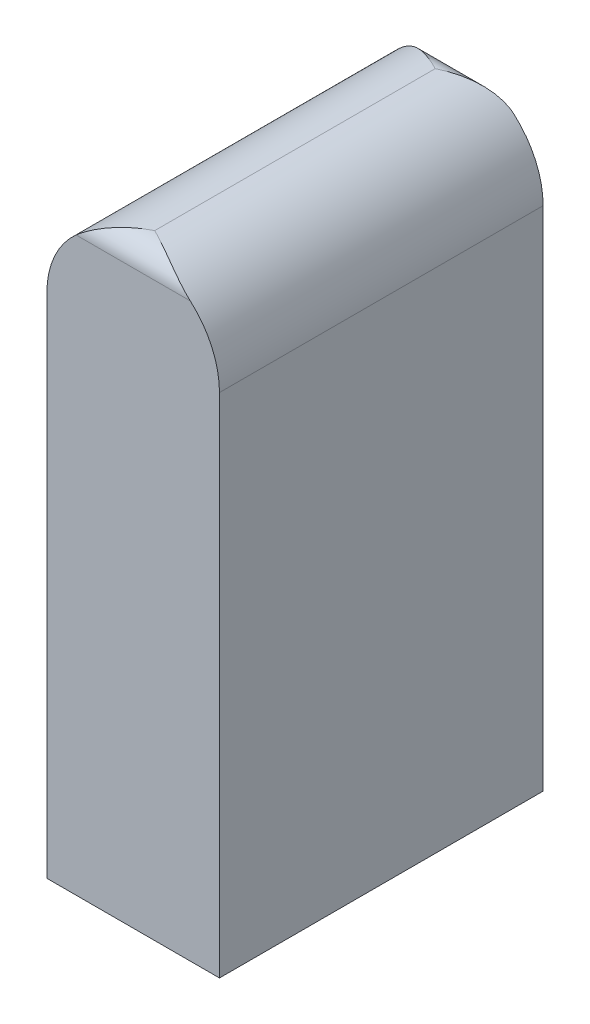
ISO-10303-21;
HEADER;
FILE_DESCRIPTION(('STEP AP214'),'2;1');
FILE_NAME('part.step','',(''),(''),'','','');
FILE_SCHEMA(('AUTOMOTIVE_DESIGN { 1 0 10303 214 1 1 1 1 }'));
ENDSEC;
DATA;
#1=APPLICATION_CONTEXT('core data for automotive mechanical design processes');
#2=APPLICATION_PROTOCOL_DEFINITION('international standard','automotive_design',2000,#1);
#3=PRODUCT_CONTEXT('',#1,'mechanical');
#4=PRODUCT('Part','Part','',(#3));
#5=PRODUCT_RELATED_PRODUCT_CATEGORY('part','',(#4));
#6=PRODUCT_DEFINITION_FORMATION('','',#4);
#7=PRODUCT_DEFINITION_CONTEXT('part definition',#1,'design');
#8=PRODUCT_DEFINITION('design','',#6,#7);
#9=PRODUCT_DEFINITION_SHAPE('','',#8);
#10=(LENGTH_UNIT() NAMED_UNIT(*) SI_UNIT(.MILLI.,.METRE.));
#11=(NAMED_UNIT(*) PLANE_ANGLE_UNIT() SI_UNIT($,.RADIAN.));
#12=(NAMED_UNIT(*) SI_UNIT($,.STERADIAN.) SOLID_ANGLE_UNIT());
#13=UNCERTAINTY_MEASURE_WITH_UNIT(LENGTH_MEASURE(1.E-05),#10,'distance_accuracy_value','');
#14=(GEOMETRIC_REPRESENTATION_CONTEXT(3) GLOBAL_UNCERTAINTY_ASSIGNED_CONTEXT((#13)) GLOBAL_UNIT_ASSIGNED_CONTEXT((#10,
#11,#12)) REPRESENTATION_CONTEXT('',''));
#15=CARTESIAN_POINT('',(0.,0.,0.));
#16=DIRECTION('',(0.,0.,1.));
#17=DIRECTION('',(1.,0.,0.));
#18=AXIS2_PLACEMENT_3D('',#15,#16,#17);
#19=CARTESIAN_POINT('',(8.,19.5,-13.));
#20=DIRECTION('',(0.,0.,1.));
#21=DIRECTION('',(1.,0.,0.));
#22=AXIS2_PLACEMENT_3D('',#19,#20,#21);
#23=CYLINDRICAL_SURFACE('',#22,8.);
#24=DIRECTION('',(0.,0.,1.));
#25=VECTOR('',#24,1.);
#26=CARTESIAN_POINT('',(8.,27.5,13.));
#27=LINE('',#26,#25);
#28=CARTESIAN_POINT('',(8.,27.5,13.));
#29=VERTEX_POINT('',#28);
#30=CARTESIAN_POINT('',(8.,27.5,-13.));
#31=VERTEX_POINT('',#30);
#32=EDGE_CURVE('E158',#29,#31,#27,.F.);
#33=ORIENTED_EDGE('',*,*,#32,.T.);
#34=CARTESIAN_POINT('',(2.7084973778708,25.5,-15.));
#35=CARTESIAN_POINT('',(2.80616741198035,25.5861628768891,-14.9999554815927));
#36=CARTESIAN_POINT('',(2.90586813397702,25.6698251299835,-14.9944373304518));
#37=CARTESIAN_POINT('',(3.10844472489316,25.8316168952697,-14.9740076754397));
#38=CARTESIAN_POINT('',(3.21131413751256,25.9097567108975,-14.9591142072519));
#39=CARTESIAN_POINT('',(3.41887744461803,26.0596955053815,-14.9216283680528));
#40=CARTESIAN_POINT('',(3.52354980024905,26.1315407346722,-14.8990993609911));
#41=CARTESIAN_POINT('',(3.73509272028618,26.2695289771789,-14.8474995862589));
#42=CARTESIAN_POINT('',(3.84196468745844,26.3356682025482,-14.8184245186045));
#43=CARTESIAN_POINT('',(4.11743445935606,26.4973924660788,-14.7370568908844));
#44=CARTESIAN_POINT('',(4.28728980345666,26.5888847906912,-14.6808473955624));
#45=CARTESIAN_POINT('',(4.63010683440643,26.7581263836888,-14.5582170603833));
#46=CARTESIAN_POINT('',(4.80306959315168,26.8358708054509,-14.491792634769));
#47=CARTESIAN_POINT('',(5.1521507656059,26.9783331873529,-14.3507864971533));
#48=CARTESIAN_POINT('',(5.32828066490314,27.0429837669403,-14.2761654940221));
#49=CARTESIAN_POINT('',(5.68216888252537,27.1591340553613,-14.1210081448137));
#50=CARTESIAN_POINT('',(5.85992691430528,27.2106360339195,-14.0404728227668));
#51=CARTESIAN_POINT('',(6.36046804593304,27.3372460386506,-13.8083988361173));
#52=CARTESIAN_POINT('',(6.68468428359475,27.3979317957355,-13.651941414824));
#53=CARTESIAN_POINT('',(7.33401573583438,27.4789208966421,-13.332951226321));
#54=CARTESIAN_POINT('',(7.65912603638828,27.4993346830672,-13.1704363235295));
#55=CARTESIAN_POINT('',(7.98933339549402,27.4999946596992,-13.005333300867));
#56=CARTESIAN_POINT('',(7.99466673208948,27.4999999926567,-13.0026666325062));
#57=CARTESIAN_POINT('',(8.,27.5,-13.));
#58=B_SPLINE_CURVE_WITH_KNOTS('',3,(#34,#35,#36,#37,#38,#39,#40,#41,#42,#43,#44,#45,#46,#47,#48,
#49,#50,#51,#52,#53,#54,#55,#56,#57),.UNSPECIFIED.,.F.,.F.,(4,2,2,2,2,2,2,2,2,2,2,4),(0.,
0.390390213966876,0.780031703746314,1.16651583748096,1.55325458993139,2.15518283254881,
2.75732285499489,3.36248686433767,3.96754633893212,5.06019416494436,6.14984130451395,
6.1677298554895),.UNSPECIFIED.);
#59=CARTESIAN_POINT('',(2.7084973778708,25.5,-15.));
#60=VERTEX_POINT('',#59);
#61=EDGE_CURVE('E11',#60,#31,#58,.T.);
#62=ORIENTED_EDGE('',*,*,#61,.F.);
#63=CARTESIAN_POINT('',(8.,19.5,-15.));
#64=DIRECTION('',(0.,0.,1.));
#65=DIRECTION('',(1.,0.,0.));
#66=AXIS2_PLACEMENT_3D('',#63,#64,#65);
#67=CIRCLE('',#66,8.);
#68=CARTESIAN_POINT('',(0.,19.5,-15.));
#69=VERTEX_POINT('',#68);
#70=EDGE_CURVE('E59',#69,#60,#67,.F.);
#71=ORIENTED_EDGE('',*,*,#70,.F.);
#72=DIRECTION('',(0.,0.,1.));
#73=VECTOR('',#72,1.);
#74=CARTESIAN_POINT('',(0.,19.5,13.));
#75=LINE('',#74,#73);
#76=CARTESIAN_POINT('',(0.,19.5,15.));
#77=VERTEX_POINT('',#76);
#78=EDGE_CURVE('E188',#77,#69,#75,.F.);
#79=ORIENTED_EDGE('',*,*,#78,.F.);
#80=CARTESIAN_POINT('',(8.,19.5,15.));
#81=DIRECTION('',(0.,0.,-1.));
#82=DIRECTION('',(-1.,0.,0.));
#83=AXIS2_PLACEMENT_3D('',#80,#81,#82);
#84=CIRCLE('',#83,8.);
#85=CARTESIAN_POINT('',(2.7084973778708,25.5,15.));
#86=VERTEX_POINT('',#85);
#87=EDGE_CURVE('E184',#86,#77,#84,.F.);
#88=ORIENTED_EDGE('',*,*,#87,.F.);
#89=CARTESIAN_POINT('',(8.,27.5,13.));
#90=CARTESIAN_POINT('',(7.99466671983046,27.4999999968615,13.0026666390348));
#91=CARTESIAN_POINT('',(7.98933338313354,27.4999946637869,13.0053333074276));
#92=CARTESIAN_POINT('',(7.73992268964102,27.4994959809781,13.1300381400368));
#93=CARTESIAN_POINT('',(7.49573807694454,27.4878435516938,13.252106824627));
#94=CARTESIAN_POINT('',(7.00795401085454,27.4420360062904,13.4935785560427));
#95=CARTESIAN_POINT('',(6.76435526106707,27.4078611063722,13.6129791637994));
#96=CARTESIAN_POINT('',(6.27814898962137,27.3164264468346,13.8463639336616));
#97=CARTESIAN_POINT('',(6.03554478204835,27.2591165745865,13.9603357334058));
#98=CARTESIAN_POINT('',(5.55315249134156,27.1207536534214,14.1789345243147));
#99=CARTESIAN_POINT('',(5.31336219384575,27.0397207873281,14.2835693607593));
#100=CARTESIAN_POINT('',(4.81477131128726,26.8438865443405,14.4886101262161));
#101=CARTESIAN_POINT('',(4.55635280609251,26.7265921052802,14.5876483217976));
#102=CARTESIAN_POINT('',(4.17521295832335,26.5279026946711,14.717443839068));
#103=CARTESIAN_POINT('',(4.04954335876928,26.4580774099979,14.7575077418244));
#104=CARTESIAN_POINT('',(3.80054596073249,26.3106899967648,14.8301742201671));
#105=CARTESIAN_POINT('',(3.67721806619892,26.2331281863574,14.8627771023945));
#106=CARTESIAN_POINT('',(3.46148029085939,26.0889758570018,14.9124620987993));
#107=CARTESIAN_POINT('',(3.36845582513831,26.0239386044356,14.9313886995423));
#108=CARTESIAN_POINT('',(3.1846146962745,25.8894468319348,14.9629311449837));
#109=CARTESIAN_POINT('',(3.09379679114404,25.8199948803978,14.9755506218612));
#110=CARTESIAN_POINT('',(2.9139363116135,25.6761886501588,14.993555380574));
#111=CARTESIAN_POINT('',(2.82491811408185,25.6017947747808,14.9988722682503));
#112=CARTESIAN_POINT('',(2.64999482528963,25.4490368448606,15.0008047282685));
#113=CARTESIAN_POINT('',(2.56409566086979,25.3706658474926,14.9974045325775));
#114=CARTESIAN_POINT('',(2.48014694607735,25.2906150159634,14.9890092831508));
#115=B_SPLINE_CURVE_WITH_KNOTS('',3,(#89,#90,#91,#92,#93,#94,#95,#96,#97,#98,#99,#100,#101,#102,
#103,#104,#105,#106,#107,#108,#109,#110,#111,#112,#113,#114),.UNSPECIFIED.,.F.,.F.,(4,2,2,2,2,2,
2,2,2,2,2,2,4),(0.,0.0178885509754406,0.836540667955611,1.65591285135711,2.47706948159163,
3.29752951619137,4.19666743021065,4.64408078950358,5.09147575720898,5.43644875013799,
5.78122284865568,6.12920448583835,6.47781601899779),.UNSPECIFIED.);
#116=EDGE_CURVE('E175',#29,#86,#115,.T.);
#117=ORIENTED_EDGE('',*,*,#116,.F.);
#118=EDGE_LOOP('',(#33,#62,#71,#79,#88,#117));
#119=FACE_BOUND('',#118,.T.);
#120=ADVANCED_FACE('F45',(#119),#23,.T.);
#121=CARTESIAN_POINT('',(8.,19.5,13.));
#122=DIRECTION('',(0.,0.,-1.));
#123=DIRECTION('',(-1.,0.,0.));
#124=AXIS2_PLACEMENT_3D('',#121,#122,#123);
#125=CYLINDRICAL_SURFACE('',#124,8.);
#126=DIRECTION('',(0.,0.,1.));
#127=VECTOR('',#126,1.);
#128=CARTESIAN_POINT('',(16.,19.5,13.));
#129=LINE('',#128,#127);
#130=CARTESIAN_POINT('',(16.,19.5,-15.));
#131=VERTEX_POINT('',#130);
#132=CARTESIAN_POINT('',(16.,19.5,15.));
#133=VERTEX_POINT('',#132);
#134=EDGE_CURVE('E134',#131,#133,#129,.T.);
#135=ORIENTED_EDGE('',*,*,#134,.F.);
#136=CARTESIAN_POINT('',(8.,19.5,-15.));
#137=DIRECTION('',(0.,0.,1.));
#138=DIRECTION('',(1.,0.,0.));
#139=AXIS2_PLACEMENT_3D('',#136,#137,#138);
#140=CIRCLE('',#139,8.);
#141=CARTESIAN_POINT('',(13.2915026221292,25.5,-15.));
#142=VERTEX_POINT('',#141);
#143=EDGE_CURVE('E113',#142,#131,#140,.F.);
#144=ORIENTED_EDGE('',*,*,#143,.F.);
#145=CARTESIAN_POINT('',(8.,27.5,-13.));
#146=CARTESIAN_POINT('',(8.00533328016954,27.4999999968615,-13.0026666390348));
#147=CARTESIAN_POINT('',(8.01066661686646,27.4999946637869,-13.0053333074276));
#148=CARTESIAN_POINT('',(8.26007731035897,27.4994959809781,-13.1300381400368));
#149=CARTESIAN_POINT('',(8.50426192305545,27.4878435516938,-13.252106824627));
#150=CARTESIAN_POINT('',(8.99204598914546,27.4420360062904,-13.4935785560427));
#151=CARTESIAN_POINT('',(9.23564473893293,27.4078611063722,-13.6129791637994));
#152=CARTESIAN_POINT('',(9.72185101037863,27.3164264468346,-13.8463639336616));
#153=CARTESIAN_POINT('',(9.96445521795165,27.2591165745865,-13.9603357334058));
#154=CARTESIAN_POINT('',(10.4468475086584,27.1207536534214,-14.1789345243147));
#155=CARTESIAN_POINT('',(10.6866378061543,27.0397207873281,-14.2835693607593));
#156=CARTESIAN_POINT('',(11.1852286887127,26.8438865443405,-14.4886101262161));
#157=CARTESIAN_POINT('',(11.4436471939075,26.7265921052802,-14.5876483217976));
#158=CARTESIAN_POINT('',(11.8247870416767,26.5279026946711,-14.717443839068));
#159=CARTESIAN_POINT('',(11.9504566412307,26.4580774099979,-14.7575077418244));
#160=CARTESIAN_POINT('',(12.1994540392675,26.3106899967648,-14.8301742201671));
#161=CARTESIAN_POINT('',(12.3227819338011,26.2331281863574,-14.8627771023945));
#162=CARTESIAN_POINT('',(12.5385197091406,26.0889758570018,-14.9124620987993));
#163=CARTESIAN_POINT('',(12.6315441748617,26.0239386044356,-14.9313886995423));
#164=CARTESIAN_POINT('',(12.8153853037255,25.8894468319348,-14.9629311449837));
#165=CARTESIAN_POINT('',(12.906203208856,25.8199948803978,-14.9755506218612));
#166=CARTESIAN_POINT('',(13.0860636883865,25.6761886501588,-14.993555380574));
#167=CARTESIAN_POINT('',(13.1750818859182,25.6017947747808,-14.9988722682503));
#168=CARTESIAN_POINT('',(13.3500051747104,25.4490368448606,-15.0008047282685));
#169=CARTESIAN_POINT('',(13.4359043391302,25.3706658474926,-14.9974045325775));
#170=CARTESIAN_POINT('',(13.5198530539226,25.2906150159634,-14.9890092831508));
#171=B_SPLINE_CURVE_WITH_KNOTS('',3,(#145,#146,#147,#148,#149,#150,#151,#152,#153,#154,#155,
#156,#157,#158,#159,#160,#161,#162,#163,#164,#165,#166,#167,#168,#169,#170),.UNSPECIFIED.,.F.,
.F.,(4,2,2,2,2,2,2,2,2,2,2,2,4),(0.,0.0178885509754406,0.836540667955609,1.65591285135711,
2.47706948159163,3.29752951619137,4.19666743021065,4.64408078950357,5.09147575720897,
5.43644875013799,5.78122284865567,6.12920448583835,6.47781601899779),.UNSPECIFIED.);
#172=EDGE_CURVE('E195',#31,#142,#171,.T.);
#173=ORIENTED_EDGE('',*,*,#172,.F.);
#174=ORIENTED_EDGE('',*,*,#32,.F.);
#175=CARTESIAN_POINT('',(13.2915026221292,25.5,15.));
#176=CARTESIAN_POINT('',(13.1938325880197,25.5861628768891,14.9999554815927));
#177=CARTESIAN_POINT('',(13.094131866023,25.6698251299835,14.9944373304518));
#178=CARTESIAN_POINT('',(12.8915552751068,25.8316168952697,14.9740076754397));
#179=CARTESIAN_POINT('',(12.7886858624874,25.9097567108976,14.9591142072519));
#180=CARTESIAN_POINT('',(12.5811225553819,26.0596955053815,14.9216283680528));
#181=CARTESIAN_POINT('',(12.4764501997509,26.1315407346723,14.8990993609911));
#182=CARTESIAN_POINT('',(12.2649072797138,26.2695289771789,14.8474995862589));
#183=CARTESIAN_POINT('',(12.1580353125416,26.3356682025483,14.8184245186045));
#184=CARTESIAN_POINT('',(11.8825655406439,26.4973924660788,14.7370568908844));
#185=CARTESIAN_POINT('',(11.7127101965433,26.5888847906912,14.6808473955624));
#186=CARTESIAN_POINT('',(11.3698931655936,26.7581263836888,14.5582170603833));
#187=CARTESIAN_POINT('',(11.1969304068483,26.8358708054509,14.491792634769));
#188=CARTESIAN_POINT('',(10.8478492343941,26.9783331873529,14.3507864971534));
#189=CARTESIAN_POINT('',(10.6717193350969,27.0429837669403,14.2761654940221));
#190=CARTESIAN_POINT('',(10.3178311174746,27.1591340553613,14.1210081448137));
#191=CARTESIAN_POINT('',(10.1400730856947,27.2106360339195,14.0404728227668));
#192=CARTESIAN_POINT('',(9.63953195406699,27.3372460386506,13.8083988361173));
#193=CARTESIAN_POINT('',(9.3153157164054,27.3979317957355,13.6519414148237));
#194=CARTESIAN_POINT('',(8.66598426416548,27.4789208966421,13.3329512263213));
#195=CARTESIAN_POINT('',(8.34087396361117,27.4993346830672,13.1704363235306));
#196=CARTESIAN_POINT('',(8.01066660450596,27.4999946596992,13.005333300867));
#197=CARTESIAN_POINT('',(8.00533326791051,27.4999999926567,13.0026666325062));
#198=CARTESIAN_POINT('',(8.,27.5,13.));
#199=B_SPLINE_CURVE_WITH_KNOTS('',3,(#175,#176,#177,#178,#179,#180,#181,#182,#183,#184,#185,
#186,#187,#188,#189,#190,#191,#192,#193,#194,#195,#196,#197,#198),.UNSPECIFIED.,.F.,.F.,(4,2,2,
2,2,2,2,2,2,2,2,4),(0.,0.390390213966894,0.780031703746358,1.16651583748099,1.55325458993139,
2.15518283254879,2.75732285499486,3.36248686433766,3.96754633893212,5.06019416494436,
6.14984130451395,6.1677298554895),.UNSPECIFIED.);
#200=CARTESIAN_POINT('',(13.2915026221292,25.5,15.));
#201=VERTEX_POINT('',#200);
#202=EDGE_CURVE('E149',#201,#29,#199,.T.);
#203=ORIENTED_EDGE('',*,*,#202,.F.);
#204=CARTESIAN_POINT('',(8.,19.5,15.));
#205=DIRECTION('',(0.,0.,-1.));
#206=DIRECTION('',(-1.,0.,0.));
#207=AXIS2_PLACEMENT_3D('',#204,#205,#206);
#208=CIRCLE('',#207,8.);
#209=EDGE_CURVE('E139',#133,#201,#208,.F.);
#210=ORIENTED_EDGE('',*,*,#209,.F.);
#211=EDGE_LOOP('',(#135,#144,#173,#174,#203,#210));
#212=FACE_BOUND('',#211,.T.);
#213=ADVANCED_FACE('F160',(#212),#125,.T.);
#214=CARTESIAN_POINT('',(16.,-27.5,-15.));
#215=DIRECTION('',(0.,1.,0.));
#216=DIRECTION('',(0.,0.,1.));
#217=AXIS2_PLACEMENT_3D('',#214,#215,#216);
#218=PLANE('',#217);
#219=DIRECTION('',(0.,0.,-1.));
#220=VECTOR('',#219,1.);
#221=CARTESIAN_POINT('',(0.,-27.5,-15.));
#222=LINE('',#221,#220);
#223=CARTESIAN_POINT('',(0.,-27.5,15.));
#224=VERTEX_POINT('',#223);
#225=CARTESIAN_POINT('',(0.,-27.5,-15.));
#226=VERTEX_POINT('',#225);
#227=EDGE_CURVE('E132',#224,#226,#222,.T.);
#228=ORIENTED_EDGE('',*,*,#227,.T.);
#229=DIRECTION('',(-1.,0.,0.));
#230=VECTOR('',#229,1.);
#231=CARTESIAN_POINT('',(16.,-27.5,-15.));
#232=LINE('',#231,#230);
#233=CARTESIAN_POINT('',(16.,-27.5,-15.));
#234=VERTEX_POINT('',#233);
#235=EDGE_CURVE('E110',#234,#226,#232,.T.);
#236=ORIENTED_EDGE('',*,*,#235,.F.);
#237=DIRECTION('',(0.,0.,-1.));
#238=VECTOR('',#237,1.);
#239=CARTESIAN_POINT('',(16.,-27.5,-15.));
#240=LINE('',#239,#238);
#241=CARTESIAN_POINT('',(16.,-27.5,15.));
#242=VERTEX_POINT('',#241);
#243=EDGE_CURVE('E119',#242,#234,#240,.T.);
#244=ORIENTED_EDGE('',*,*,#243,.F.);
#245=DIRECTION('',(-1.,0.,0.));
#246=VECTOR('',#245,1.);
#247=CARTESIAN_POINT('',(16.,-27.5,15.));
#248=LINE('',#247,#246);
#249=EDGE_CURVE('E209',#242,#224,#248,.T.);
#250=ORIENTED_EDGE('',*,*,#249,.T.);
#251=EDGE_LOOP('',(#228,#236,#244,#250));
#252=FACE_BOUND('',#251,.T.);
#253=ADVANCED_FACE('F130',(#252),#218,.F.);
#254=CARTESIAN_POINT('',(16.,-27.5,-15.));
#255=DIRECTION('',(0.,0.,1.));
#256=DIRECTION('',(1.,0.,0.));
#257=AXIS2_PLACEMENT_3D('',#254,#255,#256);
#258=PLANE('',#257);
#259=DIRECTION('',(0.,1.,0.));
#260=VECTOR('',#259,1.);
#261=CARTESIAN_POINT('',(0.,-27.5,-15.));
#262=LINE('',#261,#260);
#263=EDGE_CURVE('E191',#226,#69,#262,.T.);
#264=ORIENTED_EDGE('',*,*,#263,.T.);
#265=ORIENTED_EDGE('',*,*,#70,.T.);
#266=DIRECTION('',(-1.,0.,0.));
#267=VECTOR('',#266,1.);
#268=CARTESIAN_POINT('',(16.,25.5,-15.));
#269=LINE('',#268,#267);
#270=EDGE_CURVE('E135',#142,#60,#269,.T.);
#271=ORIENTED_EDGE('',*,*,#270,.F.);
#272=ORIENTED_EDGE('',*,*,#143,.T.);
#273=DIRECTION('',(0.,1.,0.));
#274=VECTOR('',#273,1.);
#275=CARTESIAN_POINT('',(16.,-27.5,-15.));
#276=LINE('',#275,#274);
#277=EDGE_CURVE('E105',#234,#131,#276,.T.);
#278=ORIENTED_EDGE('',*,*,#277,.F.);
#279=ORIENTED_EDGE('',*,*,#235,.T.);
#280=EDGE_LOOP('',(#264,#265,#271,#272,#278,#279));
#281=FACE_BOUND('',#280,.T.);
#282=ADVANCED_FACE('F108',(#281),#258,.F.);
#283=CARTESIAN_POINT('',(16.,25.5,-13.));
#284=DIRECTION('',(-1.,0.,0.));
#285=DIRECTION('',(0.,0.,1.));
#286=AXIS2_PLACEMENT_3D('',#283,#284,#285);
#287=CYLINDRICAL_SURFACE('',#286,2.);
#288=ORIENTED_EDGE('',*,*,#270,.T.);
#289=ORIENTED_EDGE('',*,*,#61,.T.);
#290=ORIENTED_EDGE('',*,*,#172,.T.);
#291=EDGE_LOOP('',(#288,#289,#290));
#292=FACE_BOUND('',#291,.T.);
#293=ADVANCED_FACE('F168',(#292),#287,.T.);
#294=CARTESIAN_POINT('',(16.,25.5,13.));
#295=DIRECTION('',(-1.,0.,0.));
#296=DIRECTION('',(0.,0.,1.));
#297=AXIS2_PLACEMENT_3D('',#294,#295,#296);
#298=CYLINDRICAL_SURFACE('',#297,2.);
#299=ORIENTED_EDGE('',*,*,#202,.T.);
#300=ORIENTED_EDGE('',*,*,#116,.T.);
#301=DIRECTION('',(-1.,0.,0.));
#302=VECTOR('',#301,1.);
#303=CARTESIAN_POINT('',(16.,25.5,15.));
#304=LINE('',#303,#302);
#305=EDGE_CURVE('E142',#201,#86,#304,.T.);
#306=ORIENTED_EDGE('',*,*,#305,.F.);
#307=EDGE_LOOP('',(#299,#300,#306));
#308=FACE_BOUND('',#307,.T.);
#309=ADVANCED_FACE('F163',(#308),#298,.T.);
#310=CARTESIAN_POINT('',(16.,-27.5,15.));
#311=DIRECTION('',(0.,0.,-1.));
#312=DIRECTION('',(-1.,0.,0.));
#313=AXIS2_PLACEMENT_3D('',#310,#311,#312);
#314=PLANE('',#313);
#315=ORIENTED_EDGE('',*,*,#305,.T.);
#316=ORIENTED_EDGE('',*,*,#87,.T.);
#317=DIRECTION('',(0.,-1.,0.));
#318=VECTOR('',#317,1.);
#319=CARTESIAN_POINT('',(0.,-27.5,15.));
#320=LINE('',#319,#318);
#321=EDGE_CURVE('E128',#77,#224,#320,.T.);
#322=ORIENTED_EDGE('',*,*,#321,.T.);
#323=ORIENTED_EDGE('',*,*,#249,.F.);
#324=DIRECTION('',(0.,-1.,0.));
#325=VECTOR('',#324,1.);
#326=CARTESIAN_POINT('',(16.,-27.5,15.));
#327=LINE('',#326,#325);
#328=EDGE_CURVE('E118',#133,#242,#327,.T.);
#329=ORIENTED_EDGE('',*,*,#328,.F.);
#330=ORIENTED_EDGE('',*,*,#209,.T.);
#331=EDGE_LOOP('',(#315,#316,#322,#323,#329,#330));
#332=FACE_BOUND('',#331,.T.);
#333=ADVANCED_FACE('F167',(#332),#314,.F.);
#334=CARTESIAN_POINT('',(16.,25.5,13.));
#335=DIRECTION('',(1.,0.,0.));
#336=DIRECTION('',(0.,0.,-1.));
#337=AXIS2_PLACEMENT_3D('',#334,#335,#336);
#338=PLANE('',#337);
#339=ORIENTED_EDGE('',*,*,#277,.T.);
#340=ORIENTED_EDGE('',*,*,#134,.T.);
#341=ORIENTED_EDGE('',*,*,#328,.T.);
#342=ORIENTED_EDGE('',*,*,#243,.T.);
#343=EDGE_LOOP('',(#339,#340,#341,#342));
#344=FACE_BOUND('',#343,.T.);
#345=ADVANCED_FACE('F122',(#344),#338,.T.);
#346=CARTESIAN_POINT('',(0.,25.5,13.));
#347=DIRECTION('',(1.,0.,0.));
#348=DIRECTION('',(0.,0.,-1.));
#349=AXIS2_PLACEMENT_3D('',#346,#347,#348);
#350=PLANE('',#349);
#351=ORIENTED_EDGE('',*,*,#321,.F.);
#352=ORIENTED_EDGE('',*,*,#78,.T.);
#353=ORIENTED_EDGE('',*,*,#263,.F.);
#354=ORIENTED_EDGE('',*,*,#227,.F.);
#355=EDGE_LOOP('',(#351,#352,#353,#354));
#356=FACE_BOUND('',#355,.T.);
#357=ADVANCED_FACE('F222',(#356),#350,.F.);
#358=CLOSED_SHELL('',(#120,#213,#253,#282,#293,#309,#333,#345,#357));
#359=MANIFOLD_SOLID_BREP('B2',#358);
#360=ADVANCED_BREP_SHAPE_REPRESENTATION('',(#18,#359),#14);
#361=SHAPE_DEFINITION_REPRESENTATION(#9,#360);
ENDSEC;
END-ISO-10303-21;
